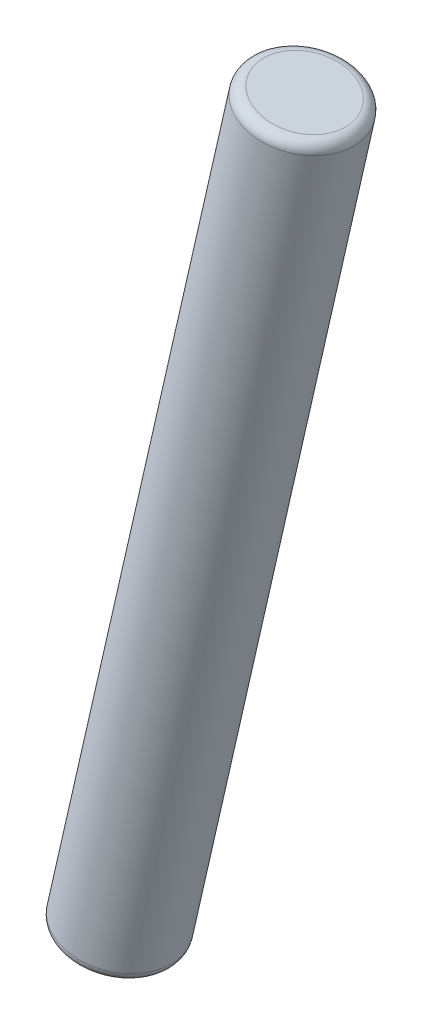
ISO-10303-21;
HEADER;
FILE_DESCRIPTION(('STEP AP214'),'2;1');
FILE_NAME('part.step','',(''),(''),'','','');
FILE_SCHEMA(('AUTOMOTIVE_DESIGN { 1 0 10303 214 1 1 1 1 }'));
ENDSEC;
DATA;
#1=APPLICATION_CONTEXT('core data for automotive mechanical design processes');
#2=APPLICATION_PROTOCOL_DEFINITION('international standard','automotive_design',2000,#1);
#3=PRODUCT_CONTEXT('',#1,'mechanical');
#4=PRODUCT('Part','Part','',(#3));
#5=PRODUCT_RELATED_PRODUCT_CATEGORY('part','',(#4));
#6=PRODUCT_DEFINITION_FORMATION('','',#4);
#7=PRODUCT_DEFINITION_CONTEXT('part definition',#1,'design');
#8=PRODUCT_DEFINITION('design','',#6,#7);
#9=PRODUCT_DEFINITION_SHAPE('','',#8);
#10=(LENGTH_UNIT() NAMED_UNIT(*) SI_UNIT(.MILLI.,.METRE.));
#11=(NAMED_UNIT(*) PLANE_ANGLE_UNIT() SI_UNIT($,.RADIAN.));
#12=(NAMED_UNIT(*) SI_UNIT($,.STERADIAN.) SOLID_ANGLE_UNIT());
#13=UNCERTAINTY_MEASURE_WITH_UNIT(LENGTH_MEASURE(1.E-05),#10,'distance_accuracy_value','');
#14=(GEOMETRIC_REPRESENTATION_CONTEXT(3) GLOBAL_UNCERTAINTY_ASSIGNED_CONTEXT((#13)) GLOBAL_UNIT_ASSIGNED_CONTEXT((#10,
#11,#12)) REPRESENTATION_CONTEXT('',''));
#15=CARTESIAN_POINT('',(0.,0.,0.));
#16=DIRECTION('',(0.,0.,1.));
#17=DIRECTION('',(1.,0.,0.));
#18=AXIS2_PLACEMENT_3D('',#15,#16,#17);
#19=CARTESIAN_POINT('',(25.6234792319269,4.40877670686669,0.));
#20=DIRECTION('',(-0.222520933956315,-0.974927912181824,0.));
#21=DIRECTION('',(0.974927912181824,-0.222520933956315,0.));
#22=AXIS2_PLACEMENT_3D('',#19,#20,#21);
#23=PLANE('',#22);
#24=CARTESIAN_POINT('',(26.5695164965475,4.19284987468712,0.241638360145948));
#25=CARTESIAN_POINT('',(26.5669467819786,4.19343639526851,0.252223433963998));
#26=CARTESIAN_POINT('',(26.5642080857035,4.19406148482164,0.262765342193874));
#27=CARTESIAN_POINT('',(26.5583959451111,4.1953880679841,0.283751621311412));
#28=CARTESIAN_POINT('',(26.5553225007938,4.19608956159342,0.294195992199074));
#29=CARTESIAN_POINT('',(26.5488440794874,4.19756821898094,0.31497599046632));
#30=CARTESIAN_POINT('',(26.5454391024984,4.19834538275915,0.325311617845904));
#31=CARTESIAN_POINT('',(26.5383012822805,4.19997454364525,0.345863067362468));
#32=CARTESIAN_POINT('',(26.5345684390516,4.20082654075316,0.356078889499448));
#33=CARTESIAN_POINT('',(26.5267788781375,4.20260445720016,0.376379787587888));
#34=CARTESIAN_POINT('',(26.5227221604523,4.20353037653926,0.386464863539349));
#35=CARTESIAN_POINT('',(26.5142891961176,4.20545514561843,0.406493470329436));
#36=CARTESIAN_POINT('',(26.5099129494681,4.20645399535849,0.416437001168062));
#37=CARTESIAN_POINT('',(26.500845613009,4.20852355573538,0.436171869836824));
#38=CARTESIAN_POINT('',(26.4961545231993,4.20959426637221,0.44596320766696));
#39=CARTESIAN_POINT('',(26.486462523861,4.21180640197499,0.465383205539433));
#40=CARTESIAN_POINT('',(26.4814616143323,4.21294782694093,0.47501186558177));
#41=CARTESIAN_POINT('',(26.4711553306269,4.21530016894189,0.49409619726013));
#42=CARTESIAN_POINT('',(26.4658499564503,4.21651108597691,0.503551868896154));
#43=CARTESIAN_POINT('',(26.4549404245841,4.21900111543401,0.522280098394051));
#44=CARTESIAN_POINT('',(26.4493362668946,4.2202802278561,0.531552656255924));
#45=CARTESIAN_POINT('',(26.4378351690731,4.22290527838217,0.549904728917723));
#46=CARTESIAN_POINT('',(26.4319382289412,4.22425121648616,0.558984243717648));
#47=CARTESIAN_POINT('',(26.4198578808265,4.22700847711169,0.576940507683844));
#48=CARTESIAN_POINT('',(26.4136744728438,4.22841979963323,0.585817256850114));
#49=CARTESIAN_POINT('',(26.4010278103758,4.23130631781438,0.60335848410361));
#50=CARTESIAN_POINT('',(26.3945645558904,4.232781513474,0.612022962190837));
#51=CARTESIAN_POINT('',(26.3813651214317,4.23579419825483,0.629130369146101));
#52=CARTESIAN_POINT('',(26.3746289414584,4.23733168737605,0.637573298014138));
#53=CARTESIAN_POINT('',(26.3608908692942,4.24046731269824,0.654228565631317));
#54=CARTESIAN_POINT('',(26.3538889771032,4.24206544889921,0.662440904380458));
#55=CARTESIAN_POINT('',(26.3396269783052,4.24532065705661,0.678626197781815));
#56=CARTESIAN_POINT('',(26.3323668716981,4.24697772901305,0.68659915243403));
#57=CARTESIAN_POINT('',(26.3175962183719,4.25034903424725,0.702297140001996));
#58=CARTESIAN_POINT('',(26.3100856716527,4.25206326752501,0.710022172917745));
#59=CARTESIAN_POINT('',(26.2948221805837,4.25554705975791,0.725216044854038));
#60=CARTESIAN_POINT('',(26.2870692362339,4.25731661871306,0.732684883874581));
#61=CARTESIAN_POINT('',(26.2713292519508,4.26090916741268,0.747358370200567));
#62=CARTESIAN_POINT('',(26.2633422120175,4.26273215715716,0.754563017506011));
#63=CARTESIAN_POINT('',(26.2471425892896,4.26642961533238,0.768700405485002));
#64=CARTESIAN_POINT('',(26.2389300064951,4.26830408376311,0.775633146158551));
#65=CARTESIAN_POINT('',(26.2222880922843,4.27210249208309,0.789219297121397));
#66=CARTESIAN_POINT('',(26.213858760868,4.27402643197233,0.795872707410694));
#67=CARTESIAN_POINT('',(26.1967923757528,4.27792172300631,0.808893072966647));
#68=CARTESIAN_POINT('',(26.1881553220539,4.27989307415104,0.815260028233303));
#69=CARTESIAN_POINT('',(26.1706827411469,4.28388107672381,0.827700665848802));
#70=CARTESIAN_POINT('',(26.1618472139389,4.28589772815185,0.833774348197644));
#71=CARTESIAN_POINT('',(26.1439871473174,4.28997417181036,0.845621936126325));
#72=CARTESIAN_POINT('',(26.1349626079041,4.29203396404084,0.851395841706164));
#73=CARTESIAN_POINT('',(26.1167341805749,4.29619448362713,0.862637693254123));
#74=CARTESIAN_POINT('',(26.107530292659,4.29829521098294,0.868105639222244));
#75=CARTESIAN_POINT('',(26.0889530240786,4.30253535130842,0.878729716333268));
#76=CARTESIAN_POINT('',(26.079579643414,4.30467476427809,0.883885847476171));
#77=CARTESIAN_POINT('',(26.0606734265868,4.30898998489429,0.893880773622384));
#78=CARTESIAN_POINT('',(26.0511405904242,4.31116579254083,0.898719568625694));
#79=CARTESIAN_POINT('',(26.0319256706009,4.31555147260144,0.908074640989832));
#80=CARTESIAN_POINT('',(26.0222435869401,4.31776134501552,0.912590918350662));
#81=CARTESIAN_POINT('',(26.0027405399379,4.32221278822448,0.92129611928692));
#82=CARTESIAN_POINT('',(25.9929195765966,4.32445435901937,0.925485042862349));
#83=CARTESIAN_POINT('',(25.9731492867669,4.32896679865979,0.933531050623523));
#84=CARTESIAN_POINT('',(25.9631999602786,4.33123766750533,0.937388134809268));
#85=CARTESIAN_POINT('',(25.9431835981429,4.33580627154383,0.944766333528716));
#86=CARTESIAN_POINT('',(25.9331165624956,4.33810400673679,0.948287448062419));
#87=CARTESIAN_POINT('',(25.9128755620758,4.34272388299772,0.95498993698015));
#88=CARTESIAN_POINT('',(25.9027015973034,4.3450460240657,0.958171311364176));
#89=CARTESIAN_POINT('',(25.8822576331698,4.34971222546986,0.964190913287176));
#90=CARTESIAN_POINT('',(25.8719876338087,4.35205628580604,0.96702914082615));
#91=CARTESIAN_POINT('',(25.8513625978701,4.35676381566808,0.972359409813905));
#92=CARTESIAN_POINT('',(25.8410075612927,4.35912728519394,0.974851451262688));
#93=CARTESIAN_POINT('',(25.8202235393543,4.36387110257297,0.979486679529659));
#94=CARTESIAN_POINT('',(25.8097945539932,4.36625145042614,0.981629866347847));
#95=CARTESIAN_POINT('',(25.7888738021061,4.3710264755237,0.985565090375506));
#96=CARTESIAN_POINT('',(25.7783820355801,4.37342115276809,0.987357127584975));
#97=CARTESIAN_POINT('',(25.7573469562095,4.3782222723677,0.990588133436863));
#98=CARTESIAN_POINT('',(25.746803643365,4.38062871472293,0.992027102079282));
#99=CARTESIAN_POINT('',(25.7256767614008,4.38545078766546,0.994550429913415));
#100=CARTESIAN_POINT('',(25.7150931922812,4.38786641825277,0.995634789105129));
#101=CARTESIAN_POINT('',(25.6938971309177,4.39270428094177,0.997447736878827));
#102=CARTESIAN_POINT('',(25.6832846386738,4.39512651304346,0.998176325460811));
#103=CARTESIAN_POINT('',(25.6620420951847,4.39997498497427,0.999276951824307));
#104=CARTESIAN_POINT('',(25.6514120439396,4.4024012248034,0.999648989605819));
#105=CARTESIAN_POINT('',(25.6301457653711,4.40725511411123,1.00003611598039));
#106=CARTESIAN_POINT('',(25.6195095380477,4.40968276358992,1.00005120457346));
#107=CARTESIAN_POINT('',(25.5982422968696,4.41453687260712,0.999724416416142));
#108=CARTESIAN_POINT('',(25.5876112830148,4.41696333214563,0.999382539665766));
#109=CARTESIAN_POINT('',(25.5663658526989,4.42181246297585,0.998342186903341));
#110=CARTESIAN_POINT('',(25.5557514362377,4.42423513426756,0.997643710891292));
#111=CARTESIAN_POINT('',(25.5345505670073,4.42907409432079,0.995890907582569));
#112=CARTESIAN_POINT('',(25.5239641142381,4.43149038308232,0.994836580285897));
#113=CARTESIAN_POINT('',(25.5028305082003,4.43631399075078,0.992373203290658));
#114=CARTESIAN_POINT('',(25.4922833549317,4.43872130965771,0.990964153592092));
#115=CARTESIAN_POINT('',(25.4712396436558,4.4435243994334,0.987792841076726));
#116=CARTESIAN_POINT('',(25.4607430856483,4.44592017030215,0.986030578259927));
#117=CARTESIAN_POINT('',(25.4398117988838,4.45069759991675,0.982154724948804));
#118=CARTESIAN_POINT('',(25.4293770701267,4.45307925866259,0.980041134454481));
#119=CARTESIAN_POINT('',(25.4085806379793,4.45782590859083,0.975464895173821));
#120=CARTESIAN_POINT('',(25.3982189345891,4.46019089977322,0.973002246387483));
#121=CARTESIAN_POINT('',(25.3771822027003,4.46499239654933,0.967629009805104));
#122=CARTESIAN_POINT('',(25.3665104723926,4.46742814935252,0.964704825247053));
#123=CARTESIAN_POINT('',(25.3454077343889,4.47224471159362,0.958526525977249));
#124=CARTESIAN_POINT('',(25.3349753994344,4.47462582396963,0.955277179052731));
#125=CARTESIAN_POINT('',(25.3143591109802,4.47933135727545,0.948466454924918));
#126=CARTESIAN_POINT('',(25.3041736947874,4.48165611205541,0.944909735683481));
#127=CARTESIAN_POINT('',(25.2840579590691,4.48624739746565,0.937502085629215));
#128=CARTESIAN_POINT('',(25.2741260485655,4.48851429122633,0.933655699647948));
#129=CARTESIAN_POINT('',(25.2545230828196,4.49298854023652,0.925686397194636));
#130=CARTESIAN_POINT('',(25.2448503160242,4.49519628613686,0.921567909702068));
#131=CARTESIAN_POINT('',(25.2257704903091,4.4995511318488,0.913071911489327));
#132=CARTESIAN_POINT('',(25.2163616067012,4.5016986481336,0.908698711520662));
#133=CARTESIAN_POINT('',(25.1978135153055,4.50593212895702,0.899710574046151));
#134=CARTESIAN_POINT('',(25.1886723772511,4.50801853406641,0.895099827218137));
#135=CARTESIAN_POINT('',(25.1706629405441,4.51212907047217,0.885653657291776));
#136=CARTESIAN_POINT('',(25.1617926128996,4.51415366487269,0.880822302888182));
#137=CARTESIAN_POINT('',(25.1443270376099,4.51814006845895,0.870951605641847));
#138=CARTESIAN_POINT('',(25.1357296711824,4.5201023612429,0.865916209616742));
#139=CARTESIAN_POINT('',(25.1188119426106,4.5239637223908,0.855654141930601));
#140=CARTESIAN_POINT('',(25.110489372572,4.52586329469218,0.850431289560524));
#141=CARTESIAN_POINT('',(25.0861197342352,4.53142550561554,0.834617435614189));
#142=CARTESIAN_POINT('',(25.0702924366744,4.53503798300082,0.823666761695476));
#143=CARTESIAN_POINT('',(25.0397579085241,4.54200728979411,0.801174991672472));
#144=CARTESIAN_POINT('',(25.02503132007,4.54536853750841,0.789661466939424));
#145=CARTESIAN_POINT('',(24.996686079305,4.55183815374208,0.76616228406923));
#146=CARTESIAN_POINT('',(24.9830472466983,4.5549511282823,0.75420224505389));
#147=CARTESIAN_POINT('',(24.9568584976575,4.56092853935188,0.72992258111516));
#148=CARTESIAN_POINT('',(24.9442877196026,4.56379773741007,0.717626619259527));
#149=CARTESIAN_POINT('',(24.9202080157223,4.56929377268397,0.692780216259169));
#150=CARTESIAN_POINT('',(24.908677744758,4.57192548178835,0.680251533868097));
#151=CARTESIAN_POINT('',(24.886645633588,4.57695416738715,0.65503751868425));
#152=CARTESIAN_POINT('',(24.8761221320237,4.57935608794536,0.642372093575388));
#153=CARTESIAN_POINT('',(24.856064671702,4.58393407237294,0.616974980107502));
#154=CARTESIAN_POINT('',(24.8465088948452,4.58611511608115,0.604261414925484));
#155=CARTESIAN_POINT('',(24.8283435469122,4.59026123820206,0.578851017472432));
#156=CARTESIAN_POINT('',(24.819712146599,4.59223129899572,0.566170598331542));
#157=CARTESIAN_POINT('',(24.8033486681128,4.59596615617243,0.540902207699098));
#158=CARTESIAN_POINT('',(24.7955948830204,4.59773590701819,0.528329020913492));
#159=CARTESIAN_POINT('',(24.7809370500125,4.60108146174333,0.503343719484237));
#160=CARTESIAN_POINT('',(24.7740115386603,4.60266216451208,0.490944848099058));
#161=CARTESIAN_POINT('',(24.7609587385854,4.60564138094233,0.466369963549126));
#162=CARTESIAN_POINT('',(24.7548103392786,4.60704471295693,0.454205743132694));
#163=CARTESIAN_POINT('',(24.7432590209499,4.60968122597468,0.430155408907583));
#164=CARTESIAN_POINT('',(24.7378354422397,4.61091912241693,0.418279730987274));
#165=CARTESIAN_POINT('',(24.7276804286296,4.61323693799214,0.394855539644618));
#166=CARTESIAN_POINT('',(24.7229288721666,4.61432144974062,0.383316200138955));
#167=CARTESIAN_POINT('',(24.7140645347839,4.61634467688682,0.360607906233681));
#168=CARTESIAN_POINT('',(24.7099322476506,4.61728784445057,0.349446959912448));
#169=CARTESIAN_POINT('',(24.7022535620944,4.61904045430163,0.327533293707625));
#170=CARTESIAN_POINT('',(24.6986883399795,4.61985419297389,0.31678750859188));
#171=CARTESIAN_POINT('',(24.6920917791188,4.62135981492154,0.295736808307978));
#172=CARTESIAN_POINT('',(24.6890423595771,4.62205582502073,0.28543785689696));
#173=CARTESIAN_POINT('',(24.683426804181,4.62333753886925,0.265309459814363));
#174=CARTESIAN_POINT('',(24.6808433753742,4.62392718962224,0.255485066578806));
#175=CARTESIAN_POINT('',(24.6739554361752,4.62549931675339,0.227605523205088));
#176=CARTESIAN_POINT('',(24.6699935502196,4.62640359133616,0.209459824543976));
#177=CARTESIAN_POINT('',(24.663500083061,4.62788568276464,0.175277841015823));
#178=CARTESIAN_POINT('',(24.6608510168719,4.62849031479368,0.159264800975865));
#179=CARTESIAN_POINT('',(24.6566439955238,4.62945053986502,0.129450594696133));
#180=CARTESIAN_POINT('',(24.6549836290716,4.62982950761964,0.115664607365354));
#181=CARTESIAN_POINT('',(24.6524573779922,4.6304061078226,0.0903711412943626));
#182=CARTESIAN_POINT('',(24.6515046085583,4.63062357116501,0.0788727362065549));
#183=CARTESIAN_POINT('',(24.6501416695931,4.63093465293665,0.0581934416762184));
#184=CARTESIAN_POINT('',(24.6496605178422,4.63104447260228,0.0490174100475979));
#185=CARTESIAN_POINT('',(24.6489518376641,4.63120622403256,0.0308343784368788));
#186=CARTESIAN_POINT('',(24.6487195387563,4.63125924462894,0.0218275777925306));
#187=CARTESIAN_POINT('',(24.6485503252045,4.63129786617594,0.00854657513777902));
#188=CARTESIAN_POINT('',(24.6485223277627,4.63130425627262,0.00427334118280202));
#189=CARTESIAN_POINT('',(24.6485154333032,4.63130582888918,-0.00914833665662972));
#190=CARTESIAN_POINT('',(24.64862898576,4.63127990977018,-0.0182971647375232));
#191=CARTESIAN_POINT('',(24.6489869794904,4.63119819811311,-0.0320149823924469));
#192=CARTESIAN_POINT('',(24.6491375927712,4.63116382103042,-0.0365867688658356));
#193=CARTESIAN_POINT('',(24.6495002151162,4.63108105370461,-0.0457277681373295));
#194=CARTESIAN_POINT('',(24.6497122245965,4.63103266336654,-0.0502969809177858));
#195=CARTESIAN_POINT('',(24.6507919032738,4.63078623150844,-0.0706051369607073));
#196=CARTESIAN_POINT('',(24.6519948456316,4.63051166664968,-0.0863269813356261));
#197=CARTESIAN_POINT('',(24.6551295561178,4.62979618915989,-0.117693075893747));
#198=CARTESIAN_POINT('',(24.6570613246067,4.62935527644657,-0.13333732603856));
#199=CARTESIAN_POINT('',(24.6616495174921,4.62830805451321,-0.164513591009014));
#200=CARTESIAN_POINT('',(24.6643059294081,4.62770174814175,-0.180045607762909));
#201=CARTESIAN_POINT('',(24.6703369270034,4.62632521625309,-0.210961677885534));
#202=CARTESIAN_POINT('',(24.6737114875874,4.62555499646378,-0.226345736404972));
#203=CARTESIAN_POINT('',(24.6774419673062,4.62470353904625,-0.241638360145922));
#204=B_SPLINE_CURVE_WITH_KNOTS('',3,(#24,#25,#26,#27,#28,#29,#30,#31,#32,#33,#34,#35,#36,#37,
#38,#39,#40,#41,#42,#43,#44,#45,#46,#47,#48,#49,#50,#51,#52,#53,#54,#55,#56,#57,#58,#59,#60,#61,
#62,#63,#64,#65,#66,#67,#68,#69,#70,#71,#72,#73,#74,#75,#76,#77,#78,#79,#80,#81,#82,#83,#84,#85,
#86,#87,#88,#89,#90,#91,#92,#93,#94,#95,#96,#97,#98,#99,#100,#101,#102,#103,#104,#105,#106,#107,
#108,#109,#110,#111,#112,#113,#114,#115,#116,#117,#118,#119,#120,#121,#122,#123,#124,#125,#126,
#127,#128,#129,#130,#131,#132,#133,#134,#135,#136,#137,#138,#139,#140,#141,#142,#143,#144,#145,
#146,#147,#148,#149,#150,#151,#152,#153,#154,#155,#156,#157,#158,#159,#160,#161,#162,#163,#164,
#165,#166,#167,#168,#169,#170,#171,#172,#173,#174,#175,#176,#177,#178,#179,#180,#181,#182,#183,
#184,#185,#186,#187,#188,#189,#190,#191,#192,#193,#194,#195,#196,#197,#198,#199,#200,#201,#202,
#203),.UNSPECIFIED.,.F.,.F.,(4,2,2,2,2,2,2,2,2,2,2,2,2,2,2,2,2,2,2,2,2,2,2,2,2,2,2,2,2,2,2,2,2,
2,2,2,2,2,2,2,2,2,2,2,2,2,2,2,2,2,2,2,2,2,2,2,2,2,2,2,2,2,2,2,2,2,2,2,2,2,2,2,2,2,2,2,2,2,2,2,2,
2,2,2,2,2,2,2,2,4),(0.,0.0327234632529734,0.0654469265059471,0.0981703897589204,
0.130893853011894,0.163617316264867,0.19634077951784,0.229064242770813,0.261787706023787,
0.294511169276761,0.327234632529734,0.359958095782708,0.392681559035681,0.425405022288655,
0.458128485541629,0.490851948794602,0.523575412047575,0.556298875300548,0.589022338553523,
0.621745801806494,0.654469265059469,0.687192728312442,0.719916191565414,0.752639654818387,
0.785363118071362,0.818086581324336,0.850810044577308,0.883533507830282,0.916256971083254,
0.94898043433623,0.981703897589202,1.01442736084218,1.04715082409515,1.07987428734812,
1.11259775060109,1.14532121385407,1.17804467710704,1.21076814036002,1.24349160361299,
1.27621506686596,1.30893853011894,1.34166199337191,1.37438545662488,1.40710891987786,
1.43983238313083,1.4725558463838,1.50527930963678,1.53800277288975,1.57072623614272,
1.60470972645651,1.63825272860973,1.67135524133786,1.70401726338283,1.73623879349309,
1.76801983042356,1.79936037293564,1.83026041979722,1.86071996978267,1.89073902167285,
1.94944930048683,2.006398125082,2.06158545278106,2.1150112420361,2.16667545242856,
2.2165780446693,2.2647189805986,2.31109822318621,2.35571573653133,2.39857148586267,
2.43966543753847,2.47899755904648,2.51656781900406,2.55237618715813,2.58642263438524,
2.61870713269155,2.64922965521293,2.70498326045402,2.7536904734802,2.79535066630632,
2.82996329467134,2.85752789804835,2.884554078051,2.89737390001274,2.92481847842752,
2.93854127621849,2.95226416699309,2.9995545289413,3.04684491428366,3.09413448520027,
3.14142240387388),.UNSPECIFIED.);
#205=CARTESIAN_POINT('',(26.5695164965475,4.19284987468712,0.241638360145948));
#206=VERTEX_POINT('',#205);
#207=CARTESIAN_POINT('',(24.6774419673062,4.62470353904625,-0.241638360145922));
#208=VERTEX_POINT('',#207);
#209=EDGE_CURVE('E44',#206,#208,#204,.T.);
#210=ORIENTED_EDGE('',*,*,#209,.F.);
#211=CARTESIAN_POINT('',(25.6234792319268,4.40877670686668,0.));
#212=DIRECTION('',(0.222520933956314,0.974927912181824,0.));
#213=DIRECTION('',(-0.974927912181824,0.222520933956314,0.));
#214=AXIS2_PLACEMENT_3D('',#211,#212,#213);
#215=CIRCLE('',#214,0.999999999999997);
#216=EDGE_CURVE('E22',#208,#206,#215,.F.);
#217=ORIENTED_EDGE('',*,*,#216,.F.);
#218=EDGE_LOOP('',(#210,#217));
#219=FACE_BOUND('',#218,.T.);
#220=ADVANCED_FACE('F17',(#219),#23,.F.);
#221=CARTESIAN_POINT('',(21.1730605528005,-15.0897815367698,0.));
#222=DIRECTION('',(-0.222520933956315,-0.974927912181824,0.));
#223=DIRECTION('',(0.974927912181824,-0.222520933956315,0.));
#224=AXIS2_PLACEMENT_3D('',#221,#222,#223);
#225=PLANE('',#224);
#226=CARTESIAN_POINT('',(22.1190978174212,-15.3057083689494,0.241638360145921));
#227=CARTESIAN_POINT('',(22.1214934597642,-15.3062551586804,0.231770796614635));
#228=CARTESIAN_POINT('',(22.1237424229455,-15.3067684698514,0.221865771074118));
#229=CARTESIAN_POINT('',(22.1279451210602,-15.3077277082699,0.201990032180278));
#230=CARTESIAN_POINT('',(22.1298988557185,-15.3081736354547,0.192019318765741));
#231=CARTESIAN_POINT('',(22.1335092258796,-15.3089976788731,0.172021439432061));
#232=CARTESIAN_POINT('',(22.1351658608082,-15.3093757949756,0.161994273403848));
#233=CARTESIAN_POINT('',(22.1381805098086,-15.3100638689006,0.141892795292568));
#234=CARTESIAN_POINT('',(22.1395385230044,-15.3103738265231,0.131818483071287));
#235=CARTESIAN_POINT('',(22.1419546608136,-15.310925294124,0.111632048225447));
#236=CARTESIAN_POINT('',(22.1430127842472,-15.311166803833,0.101519925452292));
#237=CARTESIAN_POINT('',(22.1448281678353,-15.3115811531192,0.0812672792124518));
#238=CARTESIAN_POINT('',(22.1455854265051,-15.3117539923577,0.0711267556058605));
#239=CARTESIAN_POINT('',(22.146798344912,-15.3120308327752,0.0508266022070787));
#240=CARTESIAN_POINT('',(22.147254002859,-15.3121348335457,0.0406669723018405));
#241=CARTESIAN_POINT('',(22.1478634055629,-15.3122739252622,0.0203384458334745));
#242=CARTESIAN_POINT('',(22.1480171482255,-15.3123090157302,0.0101695492065604));
#243=CARTESIAN_POINT('',(22.1480243968252,-15.3123106691909,-0.0192708391216948));
#244=CARTESIAN_POINT('',(22.1474860650137,-15.3121877976482,-0.0385440215621974));
#245=CARTESIAN_POINT('',(22.1453242550553,-15.3116943767619,-0.0770253576583776));
#246=CARTESIAN_POINT('',(22.1437007611521,-15.3113238238221,-0.0962335103657651));
#247=CARTESIAN_POINT('',(22.139374236311,-15.3103363204431,-0.134522055943138));
#248=CARTESIAN_POINT('',(22.1366711903789,-15.3097193665815,-0.153602447034858));
#249=CARTESIAN_POINT('',(22.1301945110033,-15.3082411040702,-0.191571273892542));
#250=CARTESIAN_POINT('',(22.1264208633648,-15.3073797921806,-0.210459707109917));
#251=CARTESIAN_POINT('',(22.117815587962,-15.3054156911985,-0.247981561798933));
#252=CARTESIAN_POINT('',(22.1129839468368,-15.3043128990565,-0.266614980046957));
#253=CARTESIAN_POINT('',(22.1022787943749,-15.3018695145848,-0.303564494384228));
#254=CARTESIAN_POINT('',(22.0964052705374,-15.300528919402,-0.321880586663246));
#255=CARTESIAN_POINT('',(22.0836360167805,-15.2976144170879,-0.358134120680111));
#256=CARTESIAN_POINT('',(22.0767402752407,-15.2960405073044,-0.376071558110799));
#257=CARTESIAN_POINT('',(22.0619494299604,-15.2926645897845,-0.411508135345403));
#258=CARTESIAN_POINT('',(22.0540543154889,-15.2908625795988,-0.429007270440562));
#259=CARTESIAN_POINT('',(22.0383185842216,-15.2872709981669,-0.461394172990714));
#260=CARTESIAN_POINT('',(22.0305897674169,-15.2855069445419,-0.476339236679389));
#261=CARTESIAN_POINT('',(22.0144029464523,-15.2818124050342,-0.505808402081004));
#262=CARTESIAN_POINT('',(22.0059449361789,-15.2798819177562,-0.520332500263319));
#263=CARTESIAN_POINT('',(21.9883216025687,-15.2758595036233,-0.548922061237196));
#264=CARTESIAN_POINT('',(21.9791562736451,-15.2737675754932,-0.562987520404921));
#265=CARTESIAN_POINT('',(21.9601418567987,-15.2694276557327,-0.590623659684187));
#266=CARTESIAN_POINT('',(21.9502927638069,-15.2671796629454,-0.604194336126562));
#267=CARTESIAN_POINT('',(21.9299361723153,-15.2625334006536,-0.630805946399611));
#268=CARTESIAN_POINT('',(21.9194286692538,-15.260135130108,-0.643846876559018));
#269=CARTESIAN_POINT('',(21.8977822969335,-15.2551944838593,-0.669365419562337));
#270=CARTESIAN_POINT('',(21.8866434236066,-15.2526521072277,-0.681843028775742));
#271=CARTESIAN_POINT('',(21.8637629791929,-15.247429792203,-0.706202798764284));
#272=CARTESIAN_POINT('',(21.8520214045152,-15.2447498529903,-0.718084955990836));
#273=CARTESIAN_POINT('',(21.8279657776562,-15.2392593103913,-0.741223225783058));
#274=CARTESIAN_POINT('',(21.8156517223419,-15.2364487062898,-0.752479334921623));
#275=CARTESIAN_POINT('',(21.790482829376,-15.2307040681384,-0.774336523778721));
#276=CARTESIAN_POINT('',(21.7776279890271,-15.2277700334728,-0.784937600229337));
#277=CARTESIAN_POINT('',(21.7514106141775,-15.2217860863651,-0.805457425719961));
#278=CARTESIAN_POINT('',(21.7380480773908,-15.2187361734012,-0.815376171686943));
#279=CARTESIAN_POINT('',(21.7108497057046,-15.2125283203769,-0.83450579517138));
#280=CARTESIAN_POINT('',(21.6970138689034,-15.2093703798823,-0.84371666984423));
#281=CARTESIAN_POINT('',(21.6689045124589,-15.2029546007572,-0.861406832516486));
#282=CARTESIAN_POINT('',(21.6546309912692,-15.1996967617737,-0.869886117930914));
#283=CARTESIAN_POINT('',(21.6256830088073,-15.1930895719725,-0.886091267787678));
#284=CARTESIAN_POINT('',(21.611008546313,-15.1897402208757,-0.893817129933403));
#285=CARTESIAN_POINT('',(21.5812964568352,-15.1829586288862,-0.908495539149582));
#286=CARTESIAN_POINT('',(21.5662588289211,-15.179526387781,-0.915448084237939));
#287=CARTESIAN_POINT('',(21.5358591197151,-15.1725878513378,-0.928561956697765));
#288=CARTESIAN_POINT('',(21.5204970377491,-15.1690815558459,-0.934723282425076));
#289=CARTESIAN_POINT('',(21.4894879673403,-15.162003936955,-0.946238851117598));
#290=CARTESIAN_POINT('',(21.4738409784437,-15.1584326134524,-0.951593092797196));
#291=CARTESIAN_POINT('',(21.4423023749814,-15.1512341323742,-0.961480706828742));
#292=CARTESIAN_POINT('',(21.4264107601447,-15.1476069747369,-0.96601407827131));
#293=CARTESIAN_POINT('',(21.3944238157422,-15.140306163046,-0.974248279269515));
#294=CARTESIAN_POINT('',(21.3783284860494,-15.1366325089635,-0.977949108306691));
#295=CARTESIAN_POINT('',(21.3459755476073,-15.1292481618051,-0.984508696019341));
#296=CARTESIAN_POINT('',(21.3297179388357,-15.125537468724,-0.987367454578887));
#297=CARTESIAN_POINT('',(21.29708229589,-15.1180885963917,-0.992235541498345));
#298=CARTESIAN_POINT('',(21.2807042617577,-15.1143504171499,-0.994244870153353));
#299=CARTESIAN_POINT('',(21.2478699318969,-15.1068561961085,-0.997408925025757));
#300=CARTESIAN_POINT('',(21.2314136362335,-15.1031001543238,-0.998563651954588));
#301=CARTESIAN_POINT('',(21.1984651486403,-15.0955798778045,-1.0000155320616));
#302=CARTESIAN_POINT('',(21.1819729567577,-15.0918156430807,-1.00031268636967));
#303=CARTESIAN_POINT('',(21.1489951344317,-15.0842886713743,-1.00004865849958));
#304=CARTESIAN_POINT('',(21.1325095039765,-15.0805259343891,-0.99948747786868));
#305=CARTESIAN_POINT('',(21.0995872452008,-15.0730116449676,-0.997508227922825));
#306=CARTESIAN_POINT('',(21.0831506167684,-15.0692600925057,-0.996090160568183));
#307=CARTESIAN_POINT('',(21.0503686763825,-15.061777830099,-0.99240079177789));
#308=CARTESIAN_POINT('',(21.0340233641759,-15.0580471200964,-0.990129492708083));
#309=CARTESIAN_POINT('',(21.0014661352189,-15.0506161468539,-0.984739512466841));
#310=CARTESIAN_POINT('',(20.9852542180341,-15.0469158835149,-0.981620834056089));
#311=CARTESIAN_POINT('',(20.9530055143221,-15.0395553293803,-0.974544129400904));
#312=CARTESIAN_POINT('',(20.9369687271397,-15.035895038435,-0.970586106298159));
#313=CARTESIAN_POINT('',(20.905111567337,-15.0286238518617,-0.961840908103393));
#314=CARTESIAN_POINT('',(20.889291193802,-15.0250129560248,-0.957053736517141));
#315=CARTESIAN_POINT('',(20.8579075875428,-15.0178498551598,-0.946662572493218));
#316=CARTESIAN_POINT('',(20.8423443536072,-15.0142976498551,-0.941058583905453));
#317=CARTESIAN_POINT('',(20.8115150902207,-15.0072610743169,-0.929048220523696));
#318=CARTESIAN_POINT('',(20.7962490592253,-15.0037767037307,-0.922641849900866));
#319=CARTESIAN_POINT('',(20.7660534996062,-14.9968847671048,-0.909043223394298));
#320=CARTESIAN_POINT('',(20.7511239690705,-14.9934772006286,-0.901850971977248));
#321=CARTESIAN_POINT('',(20.7216398412344,-14.9867476438048,-0.886699108595356));
#322=CARTESIAN_POINT('',(20.7070852416217,-14.9834256529294,-0.878739501364249));
#323=CARTESIAN_POINT('',(20.6783884404705,-14.9768757983992,-0.862073427087415));
#324=CARTESIAN_POINT('',(20.6642462361887,-14.9736479341183,-0.853366965011367));
#325=CARTESIAN_POINT('',(20.6364106280029,-14.9672946413517,-0.835229604957883));
#326=CARTESIAN_POINT('',(20.6227172208958,-14.9641692121349,-0.825798712152469));
#327=CARTESIAN_POINT('',(20.5958144530578,-14.958028834151,-0.806236779937595));
#328=CARTESIAN_POINT('',(20.5826050886374,-14.9550138845418,-0.796105745866544));
#329=CARTESIAN_POINT('',(20.5567044050761,-14.9491022257851,-0.77516962319905));
#330=CARTESIAN_POINT('',(20.5440130817351,-14.9462055156791,-0.764364540069236));
#331=CARTESIAN_POINT('',(20.5191811445675,-14.9405377913105,-0.742108146895851));
#332=CARTESIAN_POINT('',(20.5070405260088,-14.937766775968,-0.730656842406917));
#333=CARTESIAN_POINT('',(20.483341243838,-14.932357572675,-0.707137497940138));
#334=CARTESIAN_POINT('',(20.471782574943,-14.9297193835187,-0.69506946356285));
#335=CARTESIAN_POINT('',(20.4492769382597,-14.9245826219466,-0.670347738548712));
#336=CARTESIAN_POINT('',(20.4383299646217,-14.9220840481955,-0.657694053514557));
#337=CARTESIAN_POINT('',(20.4170758887123,-14.9172329470923,-0.631833614128257));
#338=CARTESIAN_POINT('',(20.4067687800114,-14.9148804182727,-0.618626865335655));
#339=CARTESIAN_POINT('',(20.3868209558593,-14.9103274604585,-0.591694309082157));
#340=CARTESIAN_POINT('',(20.3771802333888,-14.9081270298618,-0.57796850709105));
#341=CARTESIAN_POINT('',(20.3585899866479,-14.9038839300403,-0.550033191229013));
#342=CARTESIAN_POINT('',(20.3496404547616,-14.9018412590771,-0.535823682690409));
#343=CARTESIAN_POINT('',(20.3324556143034,-14.897918933832,-0.506957545267071));
#344=CARTESIAN_POINT('',(20.3242202975153,-14.8960392776749,-0.492300921528594));
#345=CARTESIAN_POINT('',(20.3084850696433,-14.8924478167609,-0.462578296811625));
#346=CARTESIAN_POINT('',(20.3009851497426,-14.8907360099916,-0.447512300744022));
#347=CARTESIAN_POINT('',(20.2867400142387,-14.887484652607,-0.41700972458346));
#348=CARTESIAN_POINT('',(20.2799947892209,-14.8859450998427,-0.401573149116306));
#349=CARTESIAN_POINT('',(20.2672763583764,-14.8830422024543,-0.370369173185442));
#350=CARTESIAN_POINT('',(20.2613031425444,-14.8816788555464,-0.354601777012298));
#351=CARTESIAN_POINT('',(20.2501442041539,-14.8791319017027,-0.322776723563015));
#352=CARTESIAN_POINT('',(20.2449584710072,-14.8779482923502,-0.306719070192804));
#353=CARTESIAN_POINT('',(20.2353873918859,-14.8757637565381,-0.274354984880509));
#354=CARTESIAN_POINT('',(20.2310020347613,-14.8747628275335,-0.258048556407557));
#355=CARTESIAN_POINT('',(20.2270232881799,-14.8738547045902,-0.241638360145949));
#356=B_SPLINE_CURVE_WITH_KNOTS('',3,(#226,#227,#228,#229,#230,#231,#232,#233,#234,#235,#236,
#237,#238,#239,#240,#241,#242,#243,#244,#245,#246,#247,#248,#249,#250,#251,#252,#253,#254,#255,
#256,#257,#258,#259,#260,#261,#262,#263,#264,#265,#266,#267,#268,#269,#270,#271,#272,#273,#274,
#275,#276,#277,#278,#279,#280,#281,#282,#283,#284,#285,#286,#287,#288,#289,#290,#291,#292,#293,
#294,#295,#296,#297,#298,#299,#300,#301,#302,#303,#304,#305,#306,#307,#308,#309,#310,#311,#312,
#313,#314,#315,#316,#317,#318,#319,#320,#321,#322,#323,#324,#325,#326,#327,#328,#329,#330,#331,
#332,#333,#334,#335,#336,#337,#338,#339,#340,#341,#342,#343,#344,#345,#346,#347,#348,#349,#350,
#351,#352,#353,#354,#355),.UNSPECIFIED.,.F.,.F.,(4,2,2,2,2,2,2,2,2,2,2,2,2,2,2,2,2,2,2,2,2,2,2,
2,2,2,2,2,2,2,2,2,2,2,2,2,2,2,2,2,2,2,2,2,2,2,2,2,2,2,2,2,2,2,2,2,2,2,2,2,2,2,2,2,4),(0.,
0.030505568303994,0.061011165039338,0.0915168207335477,0.12202256591413,0.152528431108586,
0.183034446844409,0.213540643649086,0.244047052050096,0.301855326196223,0.359664439726171,
0.417474356213686,0.47528503923251,0.533096452356388,0.590908559159062,0.648721323214275,
0.70653470809577,0.757265956564466,0.807997630391653,0.858729704967097,0.909462155680568,
0.960194957921836,1.01092808708067,1.06166151854685,1.11239522771013,1.16312918996031,
1.21386338068714,1.26459777528041,1.31533234912989,1.36606707762536,1.4168019361566,
1.46753690011339,1.5182719448855,1.56900704586273,1.61974217843483,1.67047731799161,
1.72121243992283,1.77194751961829,1.82268253246775,1.873417453861,1.92415225918783,
1.974886923838,2.02562142320131,2.07635573266752,2.12708982762642,2.17782368346779,
2.22855727558139,2.27929057935702,2.33002357018443,2.38075622345342,2.43148851455374,
2.48222041887519,2.53295191180751,2.5836829687405,2.63441356506392,2.68514367616754,
2.73587327744113,2.78660234427446,2.8373308520573,2.88805877617943,2.93878609203061,
2.98951277500062,3.04023880047924,3.09096414385623,3.14168878052138),.UNSPECIFIED.);
#357=CARTESIAN_POINT('',(22.1190978174212,-15.3057083689494,0.241638360145921));
#358=VERTEX_POINT('',#357);
#359=CARTESIAN_POINT('',(20.2270232881799,-14.8738547045902,-0.241638360145948));
#360=VERTEX_POINT('',#359);
#361=EDGE_CURVE('E47',#358,#360,#356,.T.);
#362=ORIENTED_EDGE('',*,*,#361,.F.);
#363=CARTESIAN_POINT('',(22.1190978174212,-15.3057083689494,0.241638360145921));
#364=CARTESIAN_POINT('',(22.0855257369448,-15.2980457606589,0.37992353099246));
#365=CARTESIAN_POINT('',(22.0152939318875,-15.28201580946,0.503675410909657));
#366=CARTESIAN_POINT('',(21.9264071259342,-15.2617279760417,0.660298315982166));
#367=CARTESIAN_POINT('',(21.788542375321,-15.2302612463658,0.775530513480105));
#368=CARTESIAN_POINT('',(21.6209734962545,-15.192014743208,0.915590464128883));
#369=CARTESIAN_POINT('',(21.410389869716,-15.1439504046372,0.969917795014795));
#370=CARTESIAN_POINT('',(21.174510082197,-15.0901123823955,1.0307711456598));
#371=CARTESIAN_POINT('',(20.9374805708404,-15.0360119431904,0.970366375605604));
#372=CARTESIAN_POINT('',(20.7014287610254,-14.9821346579822,0.910210763710915));
#373=CARTESIAN_POINT('',(20.5200018559554,-14.9407251508212,0.742493456053915));
#374=CARTESIAN_POINT('',(20.3594327383696,-14.9040762975436,0.594057808739286));
#375=CARTESIAN_POINT('',(20.274882751928,-14.8847783148785,0.388909137246609));
#376=CARTESIAN_POINT('',(20.2060891739094,-14.8690766296158,0.221991178632002));
#377=CARTESIAN_POINT('',(20.1989023838159,-14.8674362916752,0.0397297594294614));
#378=CARTESIAN_POINT('',(20.1932871024603,-14.8661546403489,-0.102677231143668));
#379=CARTESIAN_POINT('',(20.2270232881799,-14.8738547045902,-0.241638360145949));
#380=B_SPLINE_CURVE_WITH_KNOTS('',2,(#363,#364,#365,#366,#367,#368,#369,#370,#371,#372,#373,
#374,#375,#376,#377,#378,#379),.UNSPECIFIED.,.F.,.F.,(3,2,2,2,2,2,2,2,3),(0.,0.125,0.25,0.375,
0.5,0.625,0.75,0.875,1.),.UNSPECIFIED.);
#381=EDGE_CURVE('E36',#358,#360,#380,.T.);
#382=ORIENTED_EDGE('',*,*,#381,.T.);
#383=EDGE_LOOP('',(#362,#382));
#384=FACE_BOUND('',#383,.T.);
#385=ADVANCED_FACE('F63',(#384),#225,.T.);
#386=CARTESIAN_POINT('',(25.5678489984378,4.16504472882123,0.));
#387=DIRECTION('',(0.222520933956314,0.974927912181824,0.));
#388=DIRECTION('',(-0.974927912181824,0.222520933956314,0.));
#389=AXIS2_PLACEMENT_3D('',#386,#387,#388);
#390=TOROIDAL_SURFACE('',#389,1.00000000000001,0.249999999999998);
#391=CARTESIAN_POINT('',(25.5678489984378,4.16504472882123,0.));
#392=DIRECTION('',(-0.222520933956315,-0.974927912181824,0.));
#393=DIRECTION('',(0.974927912181824,-0.222520933956315,0.));
#394=AXIS2_PLACEMENT_3D('',#391,#392,#393);
#395=CIRCLE('',#394,1.25);
#396=CARTESIAN_POINT('',(26.786508888665,3.88689356137584,0.));
#397=VERTEX_POINT('',#396);
#398=EDGE_CURVE('E28',#397,#397,#395,.T.);
#399=ORIENTED_EDGE('',*,*,#398,.F.);
#400=EDGE_LOOP('',(#399));
#401=FACE_BOUND('',#400,.T.);
#402=ORIENTED_EDGE('',*,*,#216,.T.);
#403=ORIENTED_EDGE('',*,*,#209,.T.);
#404=EDGE_LOOP('',(#402,#403));
#405=FACE_BOUND('',#404,.T.);
#406=ADVANCED_FACE('F48',(#401,#405),#390,.T.);
#407=CARTESIAN_POINT('',(21.2286907862896,-14.8460495587243,0.));
#408=DIRECTION('',(-0.222520933956316,-0.974927912181823,0.));
#409=DIRECTION('',(0.974927912181823,-0.222520933956316,0.));
#410=AXIS2_PLACEMENT_3D('',#407,#408,#409);
#411=TOROIDAL_SURFACE('',#410,1.,0.250000000000001);
#412=ORIENTED_EDGE('',*,*,#361,.T.);
#413=ORIENTED_EDGE('',*,*,#381,.F.);
#414=EDGE_LOOP('',(#412,#413));
#415=FACE_BOUND('',#414,.T.);
#416=CARTESIAN_POINT('',(21.2286907862896,-14.8460495587243,0.));
#417=DIRECTION('',(-0.222520933956315,-0.974927912181824,0.));
#418=DIRECTION('',(0.974927912181824,-0.222520933956315,0.));
#419=AXIS2_PLACEMENT_3D('',#416,#417,#418);
#420=CIRCLE('',#419,1.25);
#421=CARTESIAN_POINT('',(22.4473506765169,-15.1242007261697,0.));
#422=VERTEX_POINT('',#421);
#423=EDGE_CURVE('E11',#422,#422,#420,.F.);
#424=ORIENTED_EDGE('',*,*,#423,.F.);
#425=EDGE_LOOP('',(#424));
#426=FACE_BOUND('',#425,.T.);
#427=ADVANCED_FACE('F19',(#415,#426),#411,.T.);
#428=CARTESIAN_POINT('',(23.3982698923637,-5.34050241495155,0.));
#429=DIRECTION('',(-0.222520933956315,-0.974927912181824,0.));
#430=DIRECTION('',(0.974927912181824,-0.222520933956315,0.));
#431=AXIS2_PLACEMENT_3D('',#428,#429,#430);
#432=CYLINDRICAL_SURFACE('',#431,1.25);
#433=ORIENTED_EDGE('',*,*,#398,.T.);
#434=EDGE_LOOP('',(#433));
#435=FACE_BOUND('',#434,.T.);
#436=ORIENTED_EDGE('',*,*,#423,.T.);
#437=EDGE_LOOP('',(#436));
#438=FACE_BOUND('',#437,.T.);
#439=ADVANCED_FACE('F70',(#435,#438),#432,.T.);
#440=CLOSED_SHELL('',(#220,#385,#406,#427,#439));
#441=MANIFOLD_SOLID_BREP('B1',#440);
#442=ADVANCED_BREP_SHAPE_REPRESENTATION('',(#18,#441),#14);
#443=SHAPE_DEFINITION_REPRESENTATION(#9,#442);
ENDSEC;
END-ISO-10303-21;
